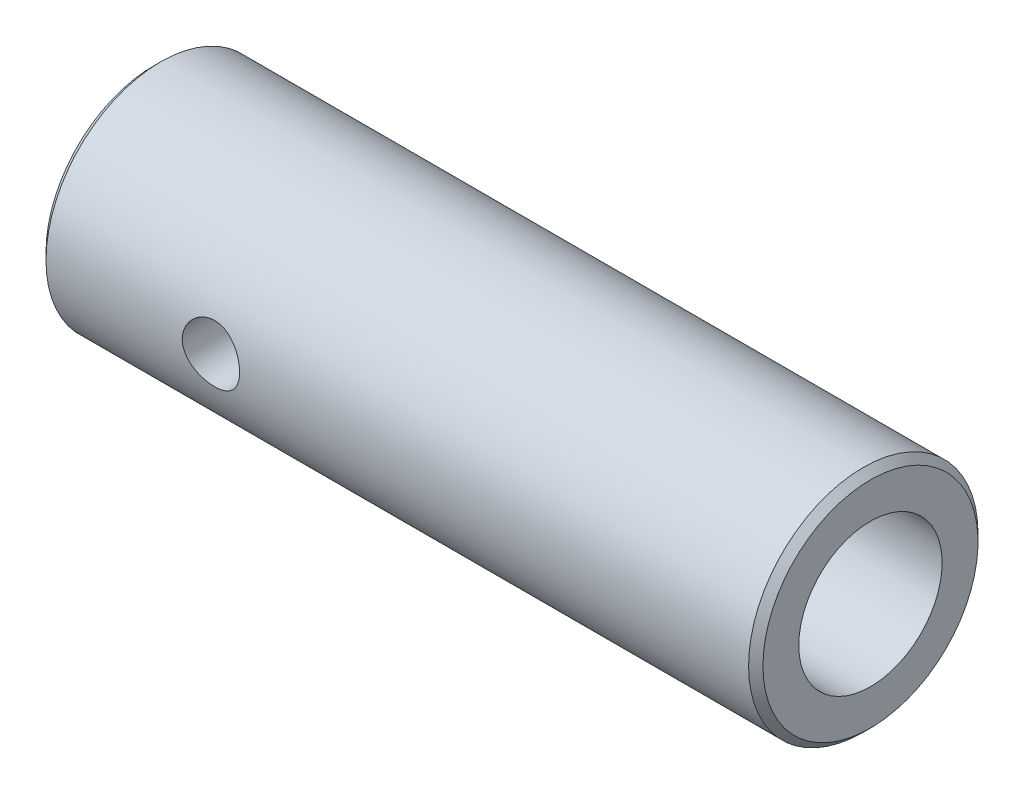
ISO-10303-21;
HEADER;
FILE_DESCRIPTION(('STEP AP214'),'2;1');
FILE_NAME('part.step','',(''),(''),'','','');
FILE_SCHEMA(('AUTOMOTIVE_DESIGN { 1 0 10303 214 1 1 1 1 }'));
ENDSEC;
DATA;
#1=APPLICATION_CONTEXT('core data for automotive mechanical design processes');
#2=APPLICATION_PROTOCOL_DEFINITION('international standard','automotive_design',2000,#1);
#3=PRODUCT_CONTEXT('',#1,'mechanical');
#4=PRODUCT('Part','Part','',(#3));
#5=PRODUCT_RELATED_PRODUCT_CATEGORY('part','',(#4));
#6=PRODUCT_DEFINITION_FORMATION('','',#4);
#7=PRODUCT_DEFINITION_CONTEXT('part definition',#1,'design');
#8=PRODUCT_DEFINITION('design','',#6,#7);
#9=PRODUCT_DEFINITION_SHAPE('','',#8);
#10=(LENGTH_UNIT() NAMED_UNIT(*) SI_UNIT(.MILLI.,.METRE.));
#11=(NAMED_UNIT(*) PLANE_ANGLE_UNIT() SI_UNIT($,.RADIAN.));
#12=(NAMED_UNIT(*) SI_UNIT($,.STERADIAN.) SOLID_ANGLE_UNIT());
#13=UNCERTAINTY_MEASURE_WITH_UNIT(LENGTH_MEASURE(1.E-05),#10,'distance_accuracy_value','');
#14=(GEOMETRIC_REPRESENTATION_CONTEXT(3) GLOBAL_UNCERTAINTY_ASSIGNED_CONTEXT((#13)) GLOBAL_UNIT_ASSIGNED_CONTEXT((#10,
#11,#12)) REPRESENTATION_CONTEXT('',''));
#15=CARTESIAN_POINT('',(0.,0.,0.));
#16=DIRECTION('',(0.,0.,1.));
#17=DIRECTION('',(1.,0.,0.));
#18=AXIS2_PLACEMENT_3D('',#15,#16,#17);
#19=CARTESIAN_POINT('',(-50.,5.,0.));
#20=DIRECTION('',(1.,0.,0.));
#21=DIRECTION('',(0.,0.,-1.));
#22=AXIS2_PLACEMENT_3D('',#19,#20,#21);
#23=PLANE('',#22);
#24=CARTESIAN_POINT('',(-50.,0.,0.));
#25=DIRECTION('',(-1.,0.,0.));
#26=DIRECTION('',(0.,0.,1.));
#27=AXIS2_PLACEMENT_3D('',#24,#25,#26);
#28=CIRCLE('',#27,5.);
#29=CARTESIAN_POINT('',(-50.,0.,5.));
#30=VERTEX_POINT('',#29);
#31=EDGE_CURVE('E419',#30,#30,#28,.T.);
#32=ORIENTED_EDGE('',*,*,#31,.F.);
#33=EDGE_LOOP('',(#32));
#34=FACE_BOUND('',#33,.T.);
#35=CARTESIAN_POINT('',(-50.,0.,0.));
#36=DIRECTION('',(-1.,0.,0.));
#37=DIRECTION('',(0.,0.,1.));
#38=AXIS2_PLACEMENT_3D('',#35,#36,#37);
#39=CIRCLE('',#38,7.5);
#40=CARTESIAN_POINT('',(-50.,0.,7.5));
#41=VERTEX_POINT('',#40);
#42=EDGE_CURVE('E10',#41,#41,#39,.T.);
#43=ORIENTED_EDGE('',*,*,#42,.T.);
#44=EDGE_LOOP('',(#43));
#45=FACE_BOUND('',#44,.T.);
#46=ADVANCED_FACE('F346',(#34,#45),#23,.F.);
#47=CARTESIAN_POINT('',(-49.5,0.,0.));
#48=DIRECTION('',(1.,0.,0.));
#49=DIRECTION('',(0.,0.,-1.));
#50=AXIS2_PLACEMENT_3D('',#47,#48,#49);
#51=CONICAL_SURFACE('',#50,8.,0.785398163397448);
#52=ORIENTED_EDGE('',*,*,#42,.F.);
#53=EDGE_LOOP('',(#52));
#54=FACE_BOUND('',#53,.T.);
#55=CARTESIAN_POINT('',(-49.5,0.,0.));
#56=DIRECTION('',(-1.,0.,0.));
#57=DIRECTION('',(0.,0.,1.));
#58=AXIS2_PLACEMENT_3D('',#55,#56,#57);
#59=CIRCLE('',#58,8.);
#60=CARTESIAN_POINT('',(-49.5,0.,8.));
#61=VERTEX_POINT('',#60);
#62=EDGE_CURVE('E357',#61,#61,#59,.T.);
#63=ORIENTED_EDGE('',*,*,#62,.T.);
#64=EDGE_LOOP('',(#63));
#65=FACE_BOUND('',#64,.T.);
#66=ADVANCED_FACE('F396',(#54,#65),#51,.T.);
#67=CARTESIAN_POINT('',(-22.885527638191,0.,0.));
#68=DIRECTION('',(-1.,0.,0.));
#69=DIRECTION('',(0.,0.,1.));
#70=AXIS2_PLACEMENT_3D('',#67,#68,#69);
#71=CYLINDRICAL_SURFACE('',#70,8.);
#72=CARTESIAN_POINT('',(-36.,0.,8.));
#73=CARTESIAN_POINT('',(-36.0000031009842,-0.110501451559642,7.9999981315735));
#74=CARTESIAN_POINT('',(-36.0091887343651,-0.221037543774351,7.99768770842435));
#75=CARTESIAN_POINT('',(-36.045633535076,-0.438941765027377,7.98869485106526));
#76=CARTESIAN_POINT('',(-36.0729029460505,-0.54630806249432,7.98200993893301));
#77=CARTESIAN_POINT('',(-36.1445856712828,-0.754694496243437,7.96500835109376));
#78=CARTESIAN_POINT('',(-36.188978398287,-0.855722084573337,7.95469603789411));
#79=CARTESIAN_POINT('',(-36.2935751867265,-1.04889617587257,7.93153791743495));
#80=CARTESIAN_POINT('',(-36.353779781492,-1.14104237913168,7.91869202472209));
#81=CARTESIAN_POINT('',(-36.4896010528722,-1.31573590306789,7.89156551455591));
#82=CARTESIAN_POINT('',(-36.5654820999454,-1.39807425341474,7.87726276197502));
#83=CARTESIAN_POINT('',(-36.729936273212,-1.54899856960443,7.84898160157248));
#84=CARTESIAN_POINT('',(-36.8185108305959,-1.61758298259892,7.83500323053157));
#85=CARTESIAN_POINT('',(-37.007460302316,-1.74003539039863,7.80873034264225));
#86=CARTESIAN_POINT('',(-37.1079909744116,-1.79366962123352,7.79646392619748));
#87=CARTESIAN_POINT('',(-37.3169978822134,-1.88319587806766,7.77532659757355));
#88=CARTESIAN_POINT('',(-37.4254728444427,-1.91909074058686,7.76645514259225));
#89=CARTESIAN_POINT('',(-37.6449913309356,-1.97140644907302,7.7533396892843));
#90=CARTESIAN_POINT('',(-37.755939861384,-1.98820302444274,7.74900654662681));
#91=CARTESIAN_POINT('',(-37.9791580919991,-2.00301570008855,7.74519149946122));
#92=CARTESIAN_POINT('',(-38.0914275742562,-2.00103485575748,7.74570880570571));
#93=CARTESIAN_POINT('',(-38.3112210769938,-1.97864869951961,7.75145607355756));
#94=CARTESIAN_POINT('',(-38.4187941619538,-1.95869112025418,7.75657150676391));
#95=CARTESIAN_POINT('',(-38.6290147345481,-1.90163224920399,7.77075612894758));
#96=CARTESIAN_POINT('',(-38.7316618707052,-1.86452973609253,7.77982559958985));
#97=CARTESIAN_POINT('',(-38.9303173550028,-1.77385263724958,7.80100151874212));
#98=CARTESIAN_POINT('',(-39.0262482290528,-1.72011555631056,7.81313769959755));
#99=CARTESIAN_POINT('',(-39.2078916130091,-1.59780836801993,7.83906281127988));
#100=CARTESIAN_POINT('',(-39.2936023307563,-1.52923566507845,7.85285203112837));
#101=CARTESIAN_POINT('',(-39.4549381542592,-1.37688456624163,7.88101174053188));
#102=CARTESIAN_POINT('',(-39.5302059867485,-1.29272834422115,7.89538759304001));
#103=CARTESIAN_POINT('',(-39.6656283232852,-1.11281589000493,7.92274620771675));
#104=CARTESIAN_POINT('',(-39.7257823656848,-1.01705930361059,7.93572892732543));
#105=CARTESIAN_POINT('',(-39.8294007816325,-0.816154518241855,7.9589030945892));
#106=CARTESIAN_POINT('',(-39.8728071203392,-0.71097519094483,7.96908480170303));
#107=CARTESIAN_POINT('',(-39.9412230742794,-0.494501344190509,7.98543889321888));
#108=CARTESIAN_POINT('',(-39.9662362085575,-0.383207998867311,7.99161204452374));
#109=CARTESIAN_POINT('',(-39.9966100874118,-0.160719960520034,7.999139990285));
#110=CARTESIAN_POINT('',(-40.0024573681004,-0.0495956266509449,8.00061404677705));
#111=CARTESIAN_POINT('',(-39.9956679972594,0.172043833068678,7.99891739752601));
#112=CARTESIAN_POINT('',(-39.9830330096012,0.28255901285946,7.99574710989128));
#113=CARTESIAN_POINT('',(-39.9400387888115,0.498152358368655,7.98519441503143));
#114=CARTESIAN_POINT('',(-39.9099449820307,0.603286825291672,7.97787512247748));
#115=CARTESIAN_POINT('',(-39.8331905546288,0.807009723270014,7.95984942178845));
#116=CARTESIAN_POINT('',(-39.7865282609158,0.905597492043512,7.94914267159856));
#117=CARTESIAN_POINT('',(-39.6770184948337,1.0953641792398,7.92524410568414));
#118=CARTESIAN_POINT('',(-39.6138985168043,1.18638058911444,7.91201156489243));
#119=CARTESIAN_POINT('',(-39.4736134549374,1.35670215152433,7.88459345583226));
#120=CARTESIAN_POINT('',(-39.3964459471775,1.43600527863068,7.87040772335606));
#121=CARTESIAN_POINT('',(-39.2279973855407,1.58265409076364,7.84225275947695));
#122=CARTESIAN_POINT('',(-39.1364163959968,1.64965849016271,7.82829738916375));
#123=CARTESIAN_POINT('',(-38.9430231540457,1.7673476786836,7.80257171169652));
#124=CARTESIAN_POINT('',(-38.8412113560537,1.81803319221058,7.79080130756035));
#125=CARTESIAN_POINT('',(-38.6307923701159,1.90126856081239,7.77090792979553));
#126=CARTESIAN_POINT('',(-38.5222298288747,1.93392586220542,7.76276340389207));
#127=CARTESIAN_POINT('',(-38.3009204828145,1.98046087993837,7.75102325453578));
#128=CARTESIAN_POINT('',(-38.1881745986233,1.99434270330488,7.74742663626581));
#129=CARTESIAN_POINT('',(-37.9651719681931,2.00271812044533,7.74526534938609));
#130=CARTESIAN_POINT('',(-37.854936753167,1.99775719704016,7.74655910304351));
#131=CARTESIAN_POINT('',(-37.6369281484427,1.96983637108383,7.7537054534379));
#132=CARTESIAN_POINT('',(-37.5291547093151,1.94687683024903,7.75955795855809));
#133=CARTESIAN_POINT('',(-37.3197220545795,1.88390842592373,7.77508347576963));
#134=CARTESIAN_POINT('',(-37.2180302596797,1.84400187290717,7.78473353648412));
#135=CARTESIAN_POINT('',(-37.0227128230484,1.7483532181401,7.80677007633105));
#136=CARTESIAN_POINT('',(-36.9290883024174,1.69260892004559,7.81915693494364));
#137=CARTESIAN_POINT('',(-36.7499271613306,1.56515699818285,7.84567512351349));
#138=CARTESIAN_POINT('',(-36.6646652354347,1.49307088388301,7.85984353109009));
#139=CARTESIAN_POINT('',(-36.5072706069395,1.33571916158632,7.88810702995047));
#140=CARTESIAN_POINT('',(-36.435141026516,1.2504504283482,7.90220210302746));
#141=CARTESIAN_POINT('',(-36.3047849219139,1.06729011560346,7.9290354086355));
#142=CARTESIAN_POINT('',(-36.2468338484379,0.96919789642185,7.94174444487824));
#143=CARTESIAN_POINT('',(-36.1483367160793,0.764354746013969,7.96406566633491));
#144=CARTESIAN_POINT('',(-36.107778185802,0.657610084582319,7.97368006933042));
#145=CARTESIAN_POINT('',(-36.0512375595605,0.459213670991295,7.98730746087389));
#146=CARTESIAN_POINT('',(-36.0320650092621,0.368506894544091,7.9920344673692));
#147=CARTESIAN_POINT('',(-36.0064454085041,0.185208095381711,7.99838140309264));
#148=CARTESIAN_POINT('',(-35.9999974009263,0.0926162149901549,8.00000156601192));
#149=CARTESIAN_POINT('',(-36.,0.,8.));
#150=B_SPLINE_CURVE_WITH_KNOTS('',3,(#72,#73,#74,#75,#76,#77,#78,#79,#80,#81,#82,#83,#84,#85,
#86,#87,#88,#89,#90,#91,#92,#93,#94,#95,#96,#97,#98,#99,#100,#101,#102,#103,#104,#105,#106,#107,
#108,#109,#110,#111,#112,#113,#114,#115,#116,#117,#118,#119,#120,#121,#122,#123,#124,#125,#126,
#127,#128,#129,#130,#131,#132,#133,#134,#135,#136,#137,#138,#139,#140,#141,#142,#143,#144,#145,
#146,#147,#148,#149),.UNSPECIFIED.,.T.,.F.,(4,2,2,2,2,2,2,2,2,2,2,2,2,2,2,2,2,2,2,2,2,2,2,2,2,2,
2,2,2,2,2,2,2,2,2,2,2,2,4),(0.,0.33116494996252,0.662517650351866,0.993473203048141,
1.32443992022577,1.66152580582852,1.99864972773416,2.34078196727742,2.68285948225825,
3.01808393468094,3.35325384154691,3.68029996013785,4.00736937959146,4.33774037169601,
4.66816921119312,5.00802001296454,5.34788119415425,5.68890972016581,6.02987298255952,
6.36211078603464,6.69431868154752,7.02160366023145,7.34892169767483,7.68204783424898,
8.01523150681787,8.35659345610397,8.69794025003773,9.03723006156478,9.37644564340972,
9.70591707202578,10.0353818794581,10.3628853408369,10.6904342418696,11.0265276855098,
11.3627009303165,11.7049624733721,12.046978184329,12.3245632392729,12.6021274139515),.UNSPECIFIED.);
#151=CARTESIAN_POINT('',(-36.,0.,8.));
#152=VERTEX_POINT('',#151);
#153=EDGE_CURVE('E387',#152,#152,#150,.T.);
#154=ORIENTED_EDGE('',*,*,#153,.T.);
#155=EDGE_LOOP('',(#154));
#156=FACE_BOUND('',#155,.T.);
#157=CARTESIAN_POINT('',(-36.,0.,-8.));
#158=CARTESIAN_POINT('',(-36.0000031009842,0.110501451559642,-7.9999981315735));
#159=CARTESIAN_POINT('',(-36.0091887343651,0.221037543774351,-7.99768770842435));
#160=CARTESIAN_POINT('',(-36.045633535076,0.438941765027377,-7.98869485106526));
#161=CARTESIAN_POINT('',(-36.0729029460505,0.54630806249432,-7.98200993893301));
#162=CARTESIAN_POINT('',(-36.1445856712828,0.754694496243437,-7.96500835109376));
#163=CARTESIAN_POINT('',(-36.188978398287,0.855722084573337,-7.95469603789411));
#164=CARTESIAN_POINT('',(-36.2935751867265,1.04889617587257,-7.93153791743495));
#165=CARTESIAN_POINT('',(-36.353779781492,1.14104237913168,-7.91869202472209));
#166=CARTESIAN_POINT('',(-36.4896010528722,1.31573590306789,-7.89156551455591));
#167=CARTESIAN_POINT('',(-36.5654820999454,1.39807425341474,-7.87726276197502));
#168=CARTESIAN_POINT('',(-36.729936273212,1.54899856960443,-7.84898160157248));
#169=CARTESIAN_POINT('',(-36.8185108305959,1.61758298259892,-7.83500323053157));
#170=CARTESIAN_POINT('',(-37.007460302316,1.74003539039863,-7.80873034264225));
#171=CARTESIAN_POINT('',(-37.1079909744116,1.79366962123352,-7.79646392619748));
#172=CARTESIAN_POINT('',(-37.3169978822134,1.88319587806766,-7.77532659757355));
#173=CARTESIAN_POINT('',(-37.4254728444427,1.91909074058686,-7.76645514259225));
#174=CARTESIAN_POINT('',(-37.6449913309356,1.97140644907302,-7.7533396892843));
#175=CARTESIAN_POINT('',(-37.755939861384,1.98820302444274,-7.74900654662681));
#176=CARTESIAN_POINT('',(-37.9791580919991,2.00301570008855,-7.74519149946122));
#177=CARTESIAN_POINT('',(-38.0914275742562,2.00103485575748,-7.74570880570571));
#178=CARTESIAN_POINT('',(-38.3112210769938,1.97864869951961,-7.75145607355756));
#179=CARTESIAN_POINT('',(-38.4187941619538,1.95869112025418,-7.75657150676391));
#180=CARTESIAN_POINT('',(-38.6290147345481,1.90163224920399,-7.77075612894758));
#181=CARTESIAN_POINT('',(-38.7316618707052,1.86452973609253,-7.77982559958985));
#182=CARTESIAN_POINT('',(-38.9303173550028,1.77385263724958,-7.80100151874212));
#183=CARTESIAN_POINT('',(-39.0262482290528,1.72011555631056,-7.81313769959755));
#184=CARTESIAN_POINT('',(-39.2078916130091,1.59780836801993,-7.83906281127988));
#185=CARTESIAN_POINT('',(-39.2936023307563,1.52923566507845,-7.85285203112837));
#186=CARTESIAN_POINT('',(-39.4549381542592,1.37688456624163,-7.88101174053188));
#187=CARTESIAN_POINT('',(-39.5302059867485,1.29272834422115,-7.89538759304001));
#188=CARTESIAN_POINT('',(-39.6656283232852,1.11281589000493,-7.92274620771675));
#189=CARTESIAN_POINT('',(-39.7257823656848,1.01705930361059,-7.93572892732543));
#190=CARTESIAN_POINT('',(-39.8294007816325,0.816154518241855,-7.9589030945892));
#191=CARTESIAN_POINT('',(-39.8728071203392,0.71097519094483,-7.96908480170303));
#192=CARTESIAN_POINT('',(-39.9412230742794,0.494501344190509,-7.98543889321888));
#193=CARTESIAN_POINT('',(-39.9662362085575,0.383207998867311,-7.99161204452374));
#194=CARTESIAN_POINT('',(-39.9966100874118,0.160719960520034,-7.999139990285));
#195=CARTESIAN_POINT('',(-40.0024573681004,0.0495956266509449,-8.00061404677705));
#196=CARTESIAN_POINT('',(-39.9956679972594,-0.172043833068678,-7.99891739752601));
#197=CARTESIAN_POINT('',(-39.9830330096012,-0.28255901285946,-7.99574710989128));
#198=CARTESIAN_POINT('',(-39.9400387888115,-0.498152358368655,-7.98519441503143));
#199=CARTESIAN_POINT('',(-39.9099449820307,-0.603286825291672,-7.97787512247748));
#200=CARTESIAN_POINT('',(-39.8331905546288,-0.807009723270014,-7.95984942178845));
#201=CARTESIAN_POINT('',(-39.7865282609158,-0.905597492043512,-7.94914267159856));
#202=CARTESIAN_POINT('',(-39.6770184948337,-1.0953641792398,-7.92524410568414));
#203=CARTESIAN_POINT('',(-39.6138985168043,-1.18638058911444,-7.91201156489243));
#204=CARTESIAN_POINT('',(-39.4736134549374,-1.35670215152433,-7.88459345583226));
#205=CARTESIAN_POINT('',(-39.3964459471775,-1.43600527863068,-7.87040772335606));
#206=CARTESIAN_POINT('',(-39.2279973855407,-1.58265409076364,-7.84225275947695));
#207=CARTESIAN_POINT('',(-39.1364163959968,-1.64965849016271,-7.82829738916375));
#208=CARTESIAN_POINT('',(-38.9430231540457,-1.7673476786836,-7.80257171169652));
#209=CARTESIAN_POINT('',(-38.8412113560537,-1.81803319221058,-7.79080130756035));
#210=CARTESIAN_POINT('',(-38.6307923701159,-1.90126856081239,-7.77090792979553));
#211=CARTESIAN_POINT('',(-38.5222298288747,-1.93392586220542,-7.76276340389207));
#212=CARTESIAN_POINT('',(-38.3009204828145,-1.98046087993837,-7.75102325453578));
#213=CARTESIAN_POINT('',(-38.1881745986233,-1.99434270330488,-7.74742663626581));
#214=CARTESIAN_POINT('',(-37.9651719681931,-2.00271812044533,-7.74526534938609));
#215=CARTESIAN_POINT('',(-37.854936753167,-1.99775719704016,-7.74655910304351));
#216=CARTESIAN_POINT('',(-37.6369281484427,-1.96983637108383,-7.7537054534379));
#217=CARTESIAN_POINT('',(-37.5291547093151,-1.94687683024903,-7.75955795855809));
#218=CARTESIAN_POINT('',(-37.3197220545795,-1.88390842592373,-7.77508347576963));
#219=CARTESIAN_POINT('',(-37.2180302596797,-1.84400187290717,-7.78473353648412));
#220=CARTESIAN_POINT('',(-37.0227128230484,-1.7483532181401,-7.80677007633105));
#221=CARTESIAN_POINT('',(-36.9290883024174,-1.69260892004559,-7.81915693494364));
#222=CARTESIAN_POINT('',(-36.7499271613306,-1.56515699818285,-7.84567512351349));
#223=CARTESIAN_POINT('',(-36.6646652354347,-1.49307088388301,-7.85984353109009));
#224=CARTESIAN_POINT('',(-36.5072706069395,-1.33571916158632,-7.88810702995047));
#225=CARTESIAN_POINT('',(-36.435141026516,-1.2504504283482,-7.90220210302746));
#226=CARTESIAN_POINT('',(-36.3047849219139,-1.06729011560346,-7.9290354086355));
#227=CARTESIAN_POINT('',(-36.2468338484379,-0.96919789642185,-7.94174444487824));
#228=CARTESIAN_POINT('',(-36.1483367160793,-0.764354746013969,-7.96406566633491));
#229=CARTESIAN_POINT('',(-36.107778185802,-0.657610084582319,-7.97368006933042));
#230=CARTESIAN_POINT('',(-36.0512375595605,-0.459213670991295,-7.98730746087389));
#231=CARTESIAN_POINT('',(-36.0320650092621,-0.368506894544091,-7.9920344673692));
#232=CARTESIAN_POINT('',(-36.0064454085041,-0.185208095381711,-7.99838140309264));
#233=CARTESIAN_POINT('',(-35.9999974009263,-0.0926162149901549,-8.00000156601192));
#234=CARTESIAN_POINT('',(-36.,0.,-8.));
#235=B_SPLINE_CURVE_WITH_KNOTS('',3,(#157,#158,#159,#160,#161,#162,#163,#164,#165,#166,#167,
#168,#169,#170,#171,#172,#173,#174,#175,#176,#177,#178,#179,#180,#181,#182,#183,#184,#185,#186,
#187,#188,#189,#190,#191,#192,#193,#194,#195,#196,#197,#198,#199,#200,#201,#202,#203,#204,#205,
#206,#207,#208,#209,#210,#211,#212,#213,#214,#215,#216,#217,#218,#219,#220,#221,#222,#223,#224,
#225,#226,#227,#228,#229,#230,#231,#232,#233,#234),.UNSPECIFIED.,.T.,.F.,(4,2,2,2,2,2,2,2,2,2,2,
2,2,2,2,2,2,2,2,2,2,2,2,2,2,2,2,2,2,2,2,2,2,2,2,2,2,2,4),(0.,0.33116494996252,0.662517650351866,
0.993473203048141,1.32443992022577,1.66152580582852,1.99864972773416,2.34078196727742,
2.68285948225825,3.01808393468094,3.35325384154691,3.68029996013785,4.00736937959146,
4.33774037169601,4.66816921119312,5.00802001296454,5.34788119415425,5.68890972016581,
6.02987298255952,6.36211078603464,6.69431868154752,7.02160366023145,7.34892169767483,
7.68204783424898,8.01523150681787,8.35659345610397,8.69794025003773,9.03723006156478,
9.37644564340972,9.70591707202578,10.0353818794581,10.3628853408369,10.6904342418696,
11.0265276855098,11.3627009303165,11.7049624733721,12.046978184329,12.3245632392729,
12.6021274139515),.UNSPECIFIED.);
#236=CARTESIAN_POINT('',(-36.,0.,-8.));
#237=VERTEX_POINT('',#236);
#238=EDGE_CURVE('E382',#237,#237,#235,.T.);
#239=ORIENTED_EDGE('',*,*,#238,.T.);
#240=EDGE_LOOP('',(#239));
#241=FACE_BOUND('',#240,.T.);
#242=ORIENTED_EDGE('',*,*,#62,.F.);
#243=EDGE_LOOP('',(#242));
#244=FACE_BOUND('',#243,.T.);
#245=CARTESIAN_POINT('',(-0.5,0.,0.));
#246=DIRECTION('',(-1.,0.,0.));
#247=DIRECTION('',(0.,0.,1.));
#248=AXIS2_PLACEMENT_3D('',#245,#246,#247);
#249=CIRCLE('',#248,8.);
#250=CARTESIAN_POINT('',(-0.5,0.,8.));
#251=VERTEX_POINT('',#250);
#252=EDGE_CURVE('E362',#251,#251,#249,.T.);
#253=ORIENTED_EDGE('',*,*,#252,.T.);
#254=EDGE_LOOP('',(#253));
#255=FACE_BOUND('',#254,.T.);
#256=ADVANCED_FACE('F391',(#156,#241,#244,#255),#71,.T.);
#257=CARTESIAN_POINT('',(0.,0.,0.));
#258=DIRECTION('',(-1.,0.,0.));
#259=DIRECTION('',(0.,0.,1.));
#260=AXIS2_PLACEMENT_3D('',#257,#258,#259);
#261=CONICAL_SURFACE('',#260,7.5,0.785398163397448);
#262=ORIENTED_EDGE('',*,*,#252,.F.);
#263=EDGE_LOOP('',(#262));
#264=FACE_BOUND('',#263,.T.);
#265=CARTESIAN_POINT('',(0.,0.,0.));
#266=DIRECTION('',(-1.,0.,0.));
#267=DIRECTION('',(0.,0.,1.));
#268=AXIS2_PLACEMENT_3D('',#265,#266,#267);
#269=CIRCLE('',#268,7.5);
#270=CARTESIAN_POINT('',(0.,0.,7.5));
#271=VERTEX_POINT('',#270);
#272=EDGE_CURVE('E413',#271,#271,#269,.T.);
#273=ORIENTED_EDGE('',*,*,#272,.T.);
#274=EDGE_LOOP('',(#273));
#275=FACE_BOUND('',#274,.T.);
#276=ADVANCED_FACE('F395',(#264,#275),#261,.T.);
#277=CARTESIAN_POINT('',(0.,5.,0.));
#278=DIRECTION('',(-1.,0.,0.));
#279=DIRECTION('',(0.,0.,1.));
#280=AXIS2_PLACEMENT_3D('',#277,#278,#279);
#281=PLANE('',#280);
#282=ORIENTED_EDGE('',*,*,#272,.F.);
#283=EDGE_LOOP('',(#282));
#284=FACE_BOUND('',#283,.T.);
#285=CARTESIAN_POINT('',(0.,0.,0.));
#286=DIRECTION('',(-1.,0.,0.));
#287=DIRECTION('',(0.,0.,1.));
#288=AXIS2_PLACEMENT_3D('',#285,#286,#287);
#289=CIRCLE('',#288,5.);
#290=CARTESIAN_POINT('',(0.,0.,5.));
#291=VERTEX_POINT('',#290);
#292=EDGE_CURVE('E415',#291,#291,#289,.T.);
#293=ORIENTED_EDGE('',*,*,#292,.T.);
#294=EDGE_LOOP('',(#293));
#295=FACE_BOUND('',#294,.T.);
#296=ADVANCED_FACE('F434',(#284,#295),#281,.F.);
#297=CARTESIAN_POINT('',(-22.885527638191,0.,0.));
#298=DIRECTION('',(-1.,0.,0.));
#299=DIRECTION('',(0.,0.,1.));
#300=AXIS2_PLACEMENT_3D('',#297,#298,#299);
#301=CYLINDRICAL_SURFACE('',#300,5.);
#302=CARTESIAN_POINT('',(-36.,0.,5.));
#303=CARTESIAN_POINT('',(-36.0000098518237,0.107493005442892,4.99999271227085));
#304=CARTESIAN_POINT('',(-36.0087177520884,0.215172564090674,4.99649294306932));
#305=CARTESIAN_POINT('',(-36.0432477035212,0.427496480417897,4.98283453100641));
#306=CARTESIAN_POINT('',(-36.0691162790861,0.532131777561249,4.97265778698877));
#307=CARTESIAN_POINT('',(-36.1368760780588,0.734953922727403,4.94674209213119));
#308=CARTESIAN_POINT('',(-36.1787148462167,0.833160661616958,4.93102136364072));
#309=CARTESIAN_POINT('',(-36.2770191733266,1.02107197032837,4.89556610796078));
#310=CARTESIAN_POINT('',(-36.3334796549189,1.11077947675099,4.87583297458057));
#311=CARTESIAN_POINT('',(-36.4622354985609,1.2835010075704,4.83330886170419));
#312=CARTESIAN_POINT('',(-36.5351066562403,1.36606227255021,4.8104229692919));
#313=CARTESIAN_POINT('',(-36.6934000034768,1.51817500478472,4.76460576906195));
#314=CARTESIAN_POINT('',(-36.7788282972117,1.58772010713353,4.74167444453792));
#315=CARTESIAN_POINT('',(-36.9644280702423,1.71487456729288,4.69722791797136));
#316=CARTESIAN_POINT('',(-37.0650864860232,1.77181498119547,4.67582115964951));
#317=CARTESIAN_POINT('',(-37.27553639842,1.86775471903715,4.63833647186793));
#318=CARTESIAN_POINT('',(-37.3853235278484,1.90676256428584,4.62225601244176));
#319=CARTESIAN_POINT('',(-37.6057123335921,1.96389882339587,4.59826357660818));
#320=CARTESIAN_POINT('',(-37.7160512355762,1.98289396580565,4.59001420355605));
#321=CARTESIAN_POINT('',(-37.9386349983073,2.00217296164003,4.58164004049144));
#322=CARTESIAN_POINT('',(-38.050878894625,2.00246601631323,4.58151125522768));
#323=CARTESIAN_POINT('',(-38.2657566714581,1.98498936750455,4.58910500279994));
#324=CARTESIAN_POINT('',(-38.368515714409,1.96847531430514,4.5962817503845));
#325=CARTESIAN_POINT('',(-38.5696595560067,1.91994688029782,4.61676187607836));
#326=CARTESIAN_POINT('',(-38.6680435881103,1.88792979480463,4.63006632321673));
#327=CARTESIAN_POINT('',(-38.8600178361961,1.80869473255107,4.6615948508853));
#328=CARTESIAN_POINT('',(-38.9534692390547,1.76117986231532,4.67991379280788));
#329=CARTESIAN_POINT('',(-39.1314158163616,1.65250646073221,4.7193811638989));
#330=CARTESIAN_POINT('',(-39.2159076094028,1.59134280510084,4.74053065456848));
#331=CARTESIAN_POINT('',(-39.380409728802,1.45155059945444,4.78526736742271));
#332=CARTESIAN_POINT('',(-39.459568729446,1.37193746297064,4.80891664976152));
#333=CARTESIAN_POINT('',(-39.603684478002,1.20031442743019,4.85459824958282));
#334=CARTESIAN_POINT('',(-39.6686383974103,1.10830206533444,4.87663024445325));
#335=CARTESIAN_POINT('',(-39.7836174474158,0.912077652605846,4.91714681264548));
#336=CARTESIAN_POINT('',(-39.8333222811971,0.80766049134648,4.93555270095415));
#337=CARTESIAN_POINT('',(-39.9141678610781,0.591023765482884,4.96614828328759));
#338=CARTESIAN_POINT('',(-39.9453180375574,0.478808196849676,4.97834113462382));
#339=CARTESIAN_POINT('',(-39.9864482954197,0.256895887607822,4.99456139506911));
#340=CARTESIAN_POINT('',(-39.9975724542536,0.147443293985536,4.99902945833514));
#341=CARTESIAN_POINT('',(-40.0017131005286,-0.0718453098078159,5.00068478510631));
#342=CARTESIAN_POINT('',(-39.9947342815475,-0.181681213223923,4.99787393582291));
#343=CARTESIAN_POINT('',(-39.963708247448,-0.393432739121987,4.98557567063753));
#344=CARTESIAN_POINT('',(-39.940442019649,-0.495482491775475,4.97639391345523));
#345=CARTESIAN_POINT('',(-39.8785642916902,-0.69413542806078,4.952594414055));
#346=CARTESIAN_POINT('',(-39.8399508203313,-0.790737910224844,4.9379759735653));
#347=CARTESIAN_POINT('',(-39.7472150603201,-0.979078785816702,4.90416594770812));
#348=CARTESIAN_POINT('',(-39.6926545279569,-1.07057802275541,4.88484815979803));
#349=CARTESIAN_POINT('',(-39.5700596760944,-1.24344359124656,4.84373364745525));
#350=CARTESIAN_POINT('',(-39.5020199570774,-1.32480584076113,4.8219359311027));
#351=CARTESIAN_POINT('',(-39.3491299870504,-1.48072304302882,4.77645117638112));
#352=CARTESIAN_POINT('',(-39.2634664584938,-1.55447393380607,4.75273441425052));
#353=CARTESIAN_POINT('',(-39.0805599169906,-1.68675119741371,4.70741672917132));
#354=CARTESIAN_POINT('',(-38.9833149996601,-1.74527506133751,4.68581615526511));
#355=CARTESIAN_POINT('',(-38.7785383054059,-1.84580750193163,4.64714299907708));
#356=CARTESIAN_POINT('',(-38.6709160007877,-1.88765059453445,4.63011630884788));
#357=CARTESIAN_POINT('',(-38.4492663482849,-1.95229621970531,4.60323673477931));
#358=CARTESIAN_POINT('',(-38.3352437941876,-1.97511280526932,4.59337855695998));
#359=CARTESIAN_POINT('',(-38.1128720982255,-1.9997156172784,4.58271759299926));
#360=CARTESIAN_POINT('',(-38.0047051604067,-2.00289708230287,4.58131421008171));
#361=CARTESIAN_POINT('',(-37.7894551422867,-1.99180315927753,4.58614836033098));
#362=CARTESIAN_POINT('',(-37.6823719260974,-1.97752998791379,4.59238492324793));
#363=CARTESIAN_POINT('',(-37.476667810145,-1.93307136615365,4.6112664907902));
#364=CARTESIAN_POINT('',(-37.377879725567,-1.90353749357098,4.62364831827449));
#365=CARTESIAN_POINT('',(-37.1866213703865,-1.83000544849102,4.65324001232697));
#366=CARTESIAN_POINT('',(-37.0941528531002,-1.78600328139381,4.67045121206007));
#367=CARTESIAN_POINT('',(-36.9123903807292,-1.68187276275973,4.70898609604491));
#368=CARTESIAN_POINT('',(-36.8235813298695,-1.62096533515949,4.73048882313242));
#369=CARTESIAN_POINT('',(-36.6570066827963,-1.4858921192715,4.77463804372237));
#370=CARTESIAN_POINT('',(-36.5792444278717,-1.41172233481813,4.79728488048406));
#371=CARTESIAN_POINT('',(-36.4317971467364,-1.24650550627247,4.84293567087394));
#372=CARTESIAN_POINT('',(-36.3629626931019,-1.15467600114614,4.86586757962185));
#373=CARTESIAN_POINT('',(-36.2416629573784,-0.95990032028578,4.90800406713717));
#374=CARTESIAN_POINT('',(-36.1892052878475,-0.856949004547236,4.92720691092906));
#375=CARTESIAN_POINT('',(-36.1033777848097,-0.6447380624952,4.95939714815861));
#376=CARTESIAN_POINT('',(-36.0696706764397,-0.535631618219695,4.97249363055028));
#377=CARTESIAN_POINT('',(-36.0213608790457,-0.312876546281222,4.99144306209366));
#378=CARTESIAN_POINT('',(-36.0066975632561,-0.199243525858915,4.99731899495638));
#379=CARTESIAN_POINT('',(-36.0006046190217,-0.0569122978909314,4.99975899504136));
#380=CARTESIAN_POINT('',(-35.9999973913708,-0.0284626887407592,5.00000192969176));
#381=CARTESIAN_POINT('',(-36.,0.,5.));
#382=B_SPLINE_CURVE_WITH_KNOTS('',3,(#302,#303,#304,#305,#306,#307,#308,#309,#310,#311,#312,
#313,#314,#315,#316,#317,#318,#319,#320,#321,#322,#323,#324,#325,#326,#327,#328,#329,#330,#331,
#332,#333,#334,#335,#336,#337,#338,#339,#340,#341,#342,#343,#344,#345,#346,#347,#348,#349,#350,
#351,#352,#353,#354,#355,#356,#357,#358,#359,#360,#361,#362,#363,#364,#365,#366,#367,#368,#369,
#370,#371,#372,#373,#374,#375,#376,#377,#378,#379,#380,#381),.UNSPECIFIED.,.T.,.F.,(4,2,2,2,2,2,
2,2,2,2,2,2,2,2,2,2,2,2,2,2,2,2,2,2,2,2,2,2,2,2,2,2,2,2,2,2,2,2,2,4),(0.,0.322402987893073,
0.645683636007934,0.967911457471579,1.29002753567984,1.62597381700397,1.96208394934411,
2.31315258819217,2.66405423118268,2.99904105308829,3.33386306340489,3.64538328401373,
3.95695787256048,4.27489126298817,4.59294421938184,4.93558349186558,5.27829092839733,
5.62776913162807,5.97706956113791,6.30569184528008,6.63422893570083,6.94800455564366,
7.26182048993797,7.58523513398263,7.9087795949897,8.25368474624415,8.59864669043749,
8.94695045140828,9.29499672645935,9.61799673392749,9.94095572563047,10.2511431854877,
10.5614163580516,10.8894546805669,11.2175920134839,11.5670042353384,11.9165786364054,
12.2596430101332,12.6016125240434,12.686980458968),.UNSPECIFIED.);
#383=CARTESIAN_POINT('',(-36.,0.,5.));
#384=VERTEX_POINT('',#383);
#385=EDGE_CURVE('E349',#384,#384,#382,.T.);
#386=ORIENTED_EDGE('',*,*,#385,.T.);
#387=EDGE_LOOP('',(#386));
#388=FACE_BOUND('',#387,.T.);
#389=CARTESIAN_POINT('',(-36.,0.,-5.));
#390=CARTESIAN_POINT('',(-36.0000098518237,-0.107493005442892,-4.99999271227085));
#391=CARTESIAN_POINT('',(-36.0087177520884,-0.215172564090674,-4.99649294306932));
#392=CARTESIAN_POINT('',(-36.0432477035212,-0.427496480417897,-4.98283453100641));
#393=CARTESIAN_POINT('',(-36.0691162790861,-0.532131777561249,-4.97265778698877));
#394=CARTESIAN_POINT('',(-36.1368760780588,-0.734953922727403,-4.94674209213119));
#395=CARTESIAN_POINT('',(-36.1787148462167,-0.833160661616958,-4.93102136364072));
#396=CARTESIAN_POINT('',(-36.2770191733266,-1.02107197032837,-4.89556610796078));
#397=CARTESIAN_POINT('',(-36.3334796549189,-1.11077947675099,-4.87583297458057));
#398=CARTESIAN_POINT('',(-36.4622354985609,-1.2835010075704,-4.83330886170419));
#399=CARTESIAN_POINT('',(-36.5351066562403,-1.36606227255021,-4.8104229692919));
#400=CARTESIAN_POINT('',(-36.6934000034768,-1.51817500478472,-4.76460576906195));
#401=CARTESIAN_POINT('',(-36.7788282972117,-1.58772010713353,-4.74167444453792));
#402=CARTESIAN_POINT('',(-36.9644280702423,-1.71487456729288,-4.69722791797136));
#403=CARTESIAN_POINT('',(-37.0650864860232,-1.77181498119547,-4.67582115964951));
#404=CARTESIAN_POINT('',(-37.27553639842,-1.86775471903715,-4.63833647186793));
#405=CARTESIAN_POINT('',(-37.3853235278484,-1.90676256428584,-4.62225601244176));
#406=CARTESIAN_POINT('',(-37.6057123335921,-1.96389882339587,-4.59826357660818));
#407=CARTESIAN_POINT('',(-37.7160512355762,-1.98289396580565,-4.59001420355605));
#408=CARTESIAN_POINT('',(-37.9386349983073,-2.00217296164003,-4.58164004049144));
#409=CARTESIAN_POINT('',(-38.050878894625,-2.00246601631323,-4.58151125522768));
#410=CARTESIAN_POINT('',(-38.2657566714581,-1.98498936750455,-4.58910500279994));
#411=CARTESIAN_POINT('',(-38.368515714409,-1.96847531430514,-4.5962817503845));
#412=CARTESIAN_POINT('',(-38.5696595560067,-1.91994688029782,-4.61676187607836));
#413=CARTESIAN_POINT('',(-38.6680435881103,-1.88792979480463,-4.63006632321673));
#414=CARTESIAN_POINT('',(-38.8600178361961,-1.80869473255107,-4.6615948508853));
#415=CARTESIAN_POINT('',(-38.9534692390547,-1.76117986231532,-4.67991379280788));
#416=CARTESIAN_POINT('',(-39.1314158163616,-1.65250646073221,-4.7193811638989));
#417=CARTESIAN_POINT('',(-39.2159076094028,-1.59134280510084,-4.74053065456848));
#418=CARTESIAN_POINT('',(-39.380409728802,-1.45155059945444,-4.78526736742271));
#419=CARTESIAN_POINT('',(-39.459568729446,-1.37193746297064,-4.80891664976152));
#420=CARTESIAN_POINT('',(-39.603684478002,-1.20031442743019,-4.85459824958282));
#421=CARTESIAN_POINT('',(-39.6686383974103,-1.10830206533444,-4.87663024445325));
#422=CARTESIAN_POINT('',(-39.7836174474158,-0.912077652605846,-4.91714681264548));
#423=CARTESIAN_POINT('',(-39.8333222811971,-0.80766049134648,-4.93555270095415));
#424=CARTESIAN_POINT('',(-39.9141678610781,-0.591023765482884,-4.96614828328759));
#425=CARTESIAN_POINT('',(-39.9453180375574,-0.478808196849676,-4.97834113462382));
#426=CARTESIAN_POINT('',(-39.9864482954197,-0.256895887607822,-4.99456139506911));
#427=CARTESIAN_POINT('',(-39.9975724542536,-0.147443293985536,-4.99902945833514));
#428=CARTESIAN_POINT('',(-40.0017131005286,0.0718453098078159,-5.00068478510631));
#429=CARTESIAN_POINT('',(-39.9947342815475,0.181681213223923,-4.99787393582291));
#430=CARTESIAN_POINT('',(-39.963708247448,0.393432739121987,-4.98557567063753));
#431=CARTESIAN_POINT('',(-39.940442019649,0.495482491775475,-4.97639391345523));
#432=CARTESIAN_POINT('',(-39.8785642916902,0.69413542806078,-4.952594414055));
#433=CARTESIAN_POINT('',(-39.8399508203313,0.790737910224844,-4.9379759735653));
#434=CARTESIAN_POINT('',(-39.7472150603201,0.979078785816702,-4.90416594770812));
#435=CARTESIAN_POINT('',(-39.6926545279569,1.07057802275541,-4.88484815979803));
#436=CARTESIAN_POINT('',(-39.5700596760944,1.24344359124656,-4.84373364745525));
#437=CARTESIAN_POINT('',(-39.5020199570774,1.32480584076113,-4.8219359311027));
#438=CARTESIAN_POINT('',(-39.3491299870504,1.48072304302882,-4.77645117638112));
#439=CARTESIAN_POINT('',(-39.2634664584938,1.55447393380607,-4.75273441425052));
#440=CARTESIAN_POINT('',(-39.0805599169906,1.68675119741371,-4.70741672917132));
#441=CARTESIAN_POINT('',(-38.9833149996601,1.74527506133751,-4.68581615526511));
#442=CARTESIAN_POINT('',(-38.7785383054059,1.84580750193163,-4.64714299907708));
#443=CARTESIAN_POINT('',(-38.6709160007877,1.88765059453445,-4.63011630884788));
#444=CARTESIAN_POINT('',(-38.4492663482849,1.95229621970531,-4.60323673477931));
#445=CARTESIAN_POINT('',(-38.3352437941876,1.97511280526932,-4.59337855695998));
#446=CARTESIAN_POINT('',(-38.1128720982255,1.9997156172784,-4.58271759299926));
#447=CARTESIAN_POINT('',(-38.0047051604067,2.00289708230287,-4.58131421008171));
#448=CARTESIAN_POINT('',(-37.7894551422867,1.99180315927753,-4.58614836033098));
#449=CARTESIAN_POINT('',(-37.6823719260974,1.97752998791379,-4.59238492324793));
#450=CARTESIAN_POINT('',(-37.476667810145,1.93307136615365,-4.6112664907902));
#451=CARTESIAN_POINT('',(-37.377879725567,1.90353749357098,-4.62364831827449));
#452=CARTESIAN_POINT('',(-37.1866213703865,1.83000544849102,-4.65324001232697));
#453=CARTESIAN_POINT('',(-37.0941528531002,1.78600328139381,-4.67045121206007));
#454=CARTESIAN_POINT('',(-36.9123903807292,1.68187276275973,-4.70898609604491));
#455=CARTESIAN_POINT('',(-36.8235813298695,1.62096533515949,-4.73048882313242));
#456=CARTESIAN_POINT('',(-36.6570066827963,1.4858921192715,-4.77463804372237));
#457=CARTESIAN_POINT('',(-36.5792444278717,1.41172233481813,-4.79728488048406));
#458=CARTESIAN_POINT('',(-36.4317971467364,1.24650550627247,-4.84293567087394));
#459=CARTESIAN_POINT('',(-36.3629626931019,1.15467600114614,-4.86586757962185));
#460=CARTESIAN_POINT('',(-36.2416629573784,0.95990032028578,-4.90800406713717));
#461=CARTESIAN_POINT('',(-36.1892052878475,0.856949004547236,-4.92720691092906));
#462=CARTESIAN_POINT('',(-36.1033777848097,0.6447380624952,-4.95939714815861));
#463=CARTESIAN_POINT('',(-36.0696706764397,0.535631618219695,-4.97249363055028));
#464=CARTESIAN_POINT('',(-36.0213608790457,0.312876546281222,-4.99144306209366));
#465=CARTESIAN_POINT('',(-36.0066975632561,0.199243525858915,-4.99731899495638));
#466=CARTESIAN_POINT('',(-36.0006046190217,0.0569122978909314,-4.99975899504136));
#467=CARTESIAN_POINT('',(-35.9999973913708,0.0284626887407592,-5.00000192969176));
#468=CARTESIAN_POINT('',(-36.,0.,-5.));
#469=B_SPLINE_CURVE_WITH_KNOTS('',3,(#389,#390,#391,#392,#393,#394,#395,#396,#397,#398,#399,
#400,#401,#402,#403,#404,#405,#406,#407,#408,#409,#410,#411,#412,#413,#414,#415,#416,#417,#418,
#419,#420,#421,#422,#423,#424,#425,#426,#427,#428,#429,#430,#431,#432,#433,#434,#435,#436,#437,
#438,#439,#440,#441,#442,#443,#444,#445,#446,#447,#448,#449,#450,#451,#452,#453,#454,#455,#456,
#457,#458,#459,#460,#461,#462,#463,#464,#465,#466,#467,#468),.UNSPECIFIED.,.T.,.F.,(4,2,2,2,2,2,
2,2,2,2,2,2,2,2,2,2,2,2,2,2,2,2,2,2,2,2,2,2,2,2,2,2,2,2,2,2,2,2,2,4),(0.,0.322402987893073,
0.645683636007934,0.967911457471579,1.29002753567984,1.62597381700397,1.96208394934411,
2.31315258819217,2.66405423118268,2.99904105308829,3.33386306340489,3.64538328401373,
3.95695787256048,4.27489126298817,4.59294421938184,4.93558349186558,5.27829092839733,
5.62776913162807,5.97706956113791,6.30569184528008,6.63422893570083,6.94800455564366,
7.26182048993797,7.58523513398263,7.9087795949897,8.25368474624415,8.59864669043749,
8.94695045140828,9.29499672645935,9.61799673392749,9.94095572563047,10.2511431854877,
10.5614163580516,10.8894546805669,11.2175920134839,11.5670042353384,11.9165786364054,
12.2596430101332,12.6016125240434,12.686980458968),.UNSPECIFIED.);
#470=CARTESIAN_POINT('',(-36.,0.,-5.));
#471=VERTEX_POINT('',#470);
#472=EDGE_CURVE('E365',#471,#471,#469,.T.);
#473=ORIENTED_EDGE('',*,*,#472,.T.);
#474=EDGE_LOOP('',(#473));
#475=FACE_BOUND('',#474,.T.);
#476=ORIENTED_EDGE('',*,*,#292,.F.);
#477=EDGE_LOOP('',(#476));
#478=FACE_BOUND('',#477,.T.);
#479=ORIENTED_EDGE('',*,*,#31,.T.);
#480=EDGE_LOOP('',(#479));
#481=FACE_BOUND('',#480,.T.);
#482=ADVANCED_FACE('F369',(#388,#475,#478,#481),#301,.F.);
#483=CARTESIAN_POINT('',(-38.,0.,-12.5));
#484=DIRECTION('',(0.,0.,1.));
#485=DIRECTION('',(1.,0.,0.));
#486=AXIS2_PLACEMENT_3D('',#483,#484,#485);
#487=CYLINDRICAL_SURFACE('',#486,2.);
#488=ORIENTED_EDGE('',*,*,#472,.F.);
#489=EDGE_LOOP('',(#488));
#490=FACE_BOUND('',#489,.T.);
#491=ORIENTED_EDGE('',*,*,#238,.F.);
#492=EDGE_LOOP('',(#491));
#493=FACE_BOUND('',#492,.T.);
#494=ADVANCED_FACE('F375',(#490,#493),#487,.F.);
#495=ORIENTED_EDGE('',*,*,#385,.F.);
#496=EDGE_LOOP('',(#495));
#497=FACE_BOUND('',#496,.T.);
#498=ORIENTED_EDGE('',*,*,#153,.F.);
#499=EDGE_LOOP('',(#498));
#500=FACE_BOUND('',#499,.T.);
#501=ADVANCED_FACE('F372',(#497,#500),#487,.F.);
#502=CLOSED_SHELL('',(#46,#66,#256,#276,#296,#482,#494,#501));
#503=MANIFOLD_SOLID_BREP('B2',#502);
#504=ADVANCED_BREP_SHAPE_REPRESENTATION('',(#18,#503),#14);
#505=SHAPE_DEFINITION_REPRESENTATION(#9,#504);
ENDSEC;
END-ISO-10303-21;
